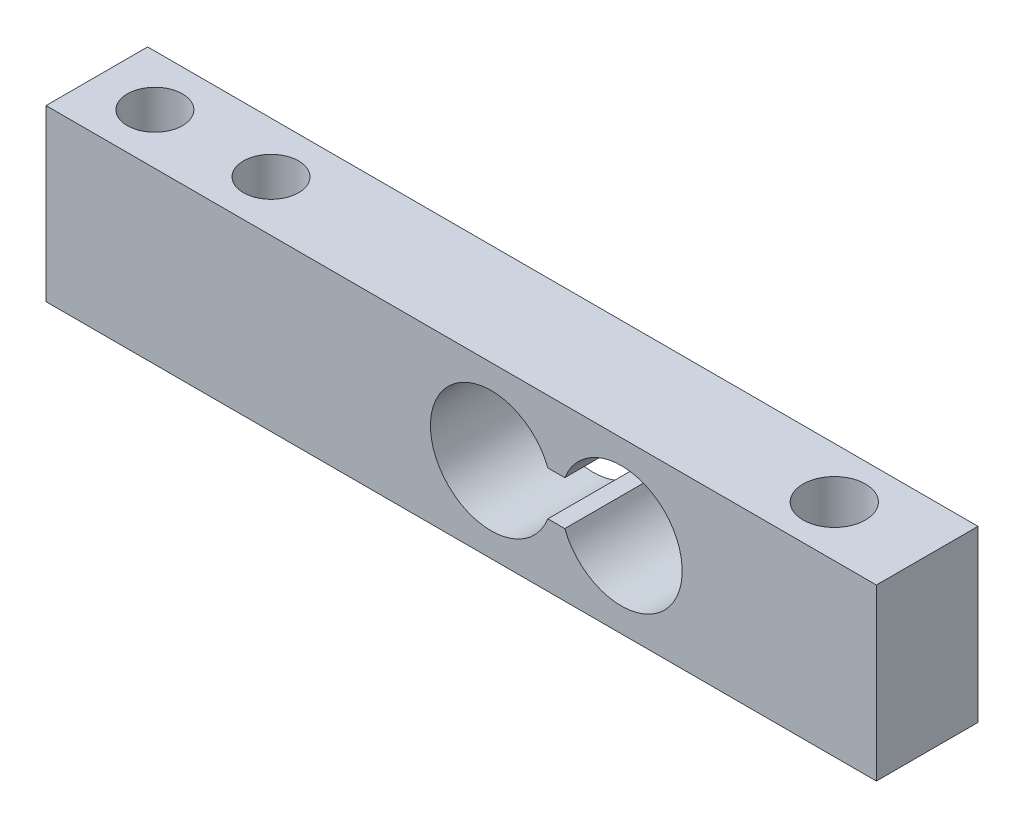
ISO-10303-21;
HEADER;
FILE_DESCRIPTION(('STEP AP214'),'2;1');
FILE_NAME('part.step','',(''),(''),'','','');
FILE_SCHEMA(('AUTOMOTIVE_DESIGN { 1 0 10303 214 1 1 1 1 }'));
ENDSEC;
DATA;
#1=APPLICATION_CONTEXT('core data for automotive mechanical design processes');
#2=APPLICATION_PROTOCOL_DEFINITION('international standard','automotive_design',2000,#1);
#3=PRODUCT_CONTEXT('',#1,'mechanical');
#4=PRODUCT('Part','Part','',(#3));
#5=PRODUCT_RELATED_PRODUCT_CATEGORY('part','',(#4));
#6=PRODUCT_DEFINITION_FORMATION('','',#4);
#7=PRODUCT_DEFINITION_CONTEXT('part definition',#1,'design');
#8=PRODUCT_DEFINITION('design','',#6,#7);
#9=PRODUCT_DEFINITION_SHAPE('','',#8);
#10=(LENGTH_UNIT() NAMED_UNIT(*) SI_UNIT(.MILLI.,.METRE.));
#11=(NAMED_UNIT(*) PLANE_ANGLE_UNIT() SI_UNIT($,.RADIAN.));
#12=(NAMED_UNIT(*) SI_UNIT($,.STERADIAN.) SOLID_ANGLE_UNIT());
#13=UNCERTAINTY_MEASURE_WITH_UNIT(LENGTH_MEASURE(1.E-05),#10,'distance_accuracy_value','');
#14=(GEOMETRIC_REPRESENTATION_CONTEXT(3) GLOBAL_UNCERTAINTY_ASSIGNED_CONTEXT((#13)) GLOBAL_UNIT_ASSIGNED_CONTEXT((#10,
#11,#12)) REPRESENTATION_CONTEXT('',''));
#15=CARTESIAN_POINT('',(0.,0.,0.));
#16=DIRECTION('',(0.,0.,1.));
#17=DIRECTION('',(1.,0.,0.));
#18=AXIS2_PLACEMENT_3D('',#15,#16,#17);
#19=CARTESIAN_POINT('',(0.,0.,7.));
#20=DIRECTION('',(1.,0.,0.));
#21=DIRECTION('',(0.,0.,-1.));
#22=AXIS2_PLACEMENT_3D('',#19,#20,#21);
#23=PLANE('',#22);
#24=DIRECTION('',(0.,-1.,0.));
#25=VECTOR('',#24,1.);
#26=CARTESIAN_POINT('',(0.,0.,0.));
#27=LINE('',#26,#25);
#28=CARTESIAN_POINT('',(0.,11.7,0.));
#29=VERTEX_POINT('',#28);
#30=CARTESIAN_POINT('',(0.,0.,0.));
#31=VERTEX_POINT('',#30);
#32=EDGE_CURVE('E155',#29,#31,#27,.T.);
#33=ORIENTED_EDGE('',*,*,#32,.T.);
#34=DIRECTION('',(0.,0.,-1.));
#35=VECTOR('',#34,1.);
#36=CARTESIAN_POINT('',(0.,0.,7.));
#37=LINE('',#36,#35);
#38=CARTESIAN_POINT('',(0.,0.,7.));
#39=VERTEX_POINT('',#38);
#40=EDGE_CURVE('E11',#39,#31,#37,.T.);
#41=ORIENTED_EDGE('',*,*,#40,.F.);
#42=DIRECTION('',(0.,-1.,0.));
#43=VECTOR('',#42,1.);
#44=CARTESIAN_POINT('',(0.,0.,7.));
#45=LINE('',#44,#43);
#46=CARTESIAN_POINT('',(0.,11.7,7.));
#47=VERTEX_POINT('',#46);
#48=EDGE_CURVE('E144',#47,#39,#45,.T.);
#49=ORIENTED_EDGE('',*,*,#48,.F.);
#50=DIRECTION('',(0.,0.,-1.));
#51=VECTOR('',#50,1.);
#52=CARTESIAN_POINT('',(0.,11.7,7.));
#53=LINE('',#52,#51);
#54=EDGE_CURVE('E154',#47,#29,#53,.T.);
#55=ORIENTED_EDGE('',*,*,#54,.T.);
#56=EDGE_LOOP('',(#33,#41,#49,#55));
#57=FACE_BOUND('',#56,.T.);
#58=ADVANCED_FACE('F32',(#57),#23,.F.);
#59=CARTESIAN_POINT('',(0.,0.,7.));
#60=DIRECTION('',(0.,1.,0.));
#61=DIRECTION('',(0.,0.,1.));
#62=AXIS2_PLACEMENT_3D('',#59,#60,#61);
#63=PLANE('',#62);
#64=CARTESIAN_POINT('',(50.8,0.,3.5));
#65=DIRECTION('',(0.,1.,0.));
#66=DIRECTION('',(0.,0.,1.));
#67=AXIS2_PLACEMENT_3D('',#64,#65,#66);
#68=CIRCLE('',#67,2.15);
#69=CARTESIAN_POINT('',(50.8,0.,5.65));
#70=VERTEX_POINT('',#69);
#71=EDGE_CURVE('E135',#70,#70,#68,.T.);
#72=ORIENTED_EDGE('',*,*,#71,.T.);
#73=EDGE_LOOP('',(#72));
#74=FACE_BOUND('',#73,.T.);
#75=CARTESIAN_POINT('',(4.,0.,3.5));
#76=DIRECTION('',(0.,1.,0.));
#77=DIRECTION('',(0.,0.,1.));
#78=AXIS2_PLACEMENT_3D('',#75,#76,#77);
#79=CIRCLE('',#78,1.9);
#80=CARTESIAN_POINT('',(4.,0.,5.4));
#81=VERTEX_POINT('',#80);
#82=EDGE_CURVE('E139',#81,#81,#79,.T.);
#83=ORIENTED_EDGE('',*,*,#82,.T.);
#84=EDGE_LOOP('',(#83));
#85=FACE_BOUND('',#84,.T.);
#86=CARTESIAN_POINT('',(12.,0.,3.5));
#87=DIRECTION('',(0.,1.,0.));
#88=DIRECTION('',(0.,0.,1.));
#89=AXIS2_PLACEMENT_3D('',#86,#87,#88);
#90=CIRCLE('',#89,1.9);
#91=CARTESIAN_POINT('',(12.,0.,5.4));
#92=VERTEX_POINT('',#91);
#93=EDGE_CURVE('E131',#92,#92,#90,.T.);
#94=ORIENTED_EDGE('',*,*,#93,.T.);
#95=EDGE_LOOP('',(#94));
#96=FACE_BOUND('',#95,.T.);
#97=DIRECTION('',(1.,0.,0.));
#98=VECTOR('',#97,1.);
#99=CARTESIAN_POINT('',(0.,0.,0.));
#100=LINE('',#99,#98);
#101=CARTESIAN_POINT('',(57.2,0.,0.));
#102=VERTEX_POINT('',#101);
#103=EDGE_CURVE('E158',#31,#102,#100,.T.);
#104=ORIENTED_EDGE('',*,*,#103,.T.);
#105=DIRECTION('',(0.,0.,-1.));
#106=VECTOR('',#105,1.);
#107=CARTESIAN_POINT('',(57.2,0.,7.));
#108=LINE('',#107,#106);
#109=CARTESIAN_POINT('',(57.2,0.,7.));
#110=VERTEX_POINT('',#109);
#111=EDGE_CURVE('E40',#110,#102,#108,.T.);
#112=ORIENTED_EDGE('',*,*,#111,.F.);
#113=DIRECTION('',(1.,0.,0.));
#114=VECTOR('',#113,1.);
#115=CARTESIAN_POINT('',(0.,0.,7.));
#116=LINE('',#115,#114);
#117=EDGE_CURVE('E147',#39,#110,#116,.T.);
#118=ORIENTED_EDGE('',*,*,#117,.F.);
#119=ORIENTED_EDGE('',*,*,#40,.T.);
#120=EDGE_LOOP('',(#104,#112,#118,#119));
#121=FACE_BOUND('',#120,.T.);
#122=ADVANCED_FACE('F196',(#74,#85,#96,#121),#63,.F.);
#123=CARTESIAN_POINT('',(57.2,0.,7.));
#124=DIRECTION('',(-1.,0.,0.));
#125=DIRECTION('',(0.,0.,1.));
#126=AXIS2_PLACEMENT_3D('',#123,#124,#125);
#127=PLANE('',#126);
#128=DIRECTION('',(0.,1.,0.));
#129=VECTOR('',#128,1.);
#130=CARTESIAN_POINT('',(57.2,0.,0.));
#131=LINE('',#130,#129);
#132=CARTESIAN_POINT('',(57.2,11.7,0.));
#133=VERTEX_POINT('',#132);
#134=EDGE_CURVE('E160',#102,#133,#131,.T.);
#135=ORIENTED_EDGE('',*,*,#134,.T.);
#136=DIRECTION('',(0.,0.,-1.));
#137=VECTOR('',#136,1.);
#138=CARTESIAN_POINT('',(57.2,11.7,7.));
#139=LINE('',#138,#137);
#140=CARTESIAN_POINT('',(57.2,11.7,7.));
#141=VERTEX_POINT('',#140);
#142=EDGE_CURVE('E165',#141,#133,#139,.T.);
#143=ORIENTED_EDGE('',*,*,#142,.F.);
#144=DIRECTION('',(0.,1.,0.));
#145=VECTOR('',#144,1.);
#146=CARTESIAN_POINT('',(57.2,0.,7.));
#147=LINE('',#146,#145);
#148=EDGE_CURVE('E150',#110,#141,#147,.T.);
#149=ORIENTED_EDGE('',*,*,#148,.F.);
#150=ORIENTED_EDGE('',*,*,#111,.T.);
#151=EDGE_LOOP('',(#135,#143,#149,#150));
#152=FACE_BOUND('',#151,.T.);
#153=ADVANCED_FACE('F201',(#152),#127,.F.);
#154=CARTESIAN_POINT('',(0.,11.7,7.));
#155=DIRECTION('',(0.,-1.,0.));
#156=DIRECTION('',(0.,0.,-1.));
#157=AXIS2_PLACEMENT_3D('',#154,#155,#156);
#158=PLANE('',#157);
#159=CARTESIAN_POINT('',(50.8,11.7,3.5));
#160=DIRECTION('',(0.,-1.,0.));
#161=DIRECTION('',(0.,0.,-1.));
#162=AXIS2_PLACEMENT_3D('',#159,#160,#161);
#163=CIRCLE('',#162,2.15);
#164=CARTESIAN_POINT('',(50.8,11.7,1.35));
#165=VERTEX_POINT('',#164);
#166=EDGE_CURVE('E35',#165,#165,#163,.T.);
#167=ORIENTED_EDGE('',*,*,#166,.T.);
#168=EDGE_LOOP('',(#167));
#169=FACE_BOUND('',#168,.T.);
#170=CARTESIAN_POINT('',(4.,11.7,3.5));
#171=DIRECTION('',(0.,-1.,0.));
#172=DIRECTION('',(0.,0.,-1.));
#173=AXIS2_PLACEMENT_3D('',#170,#171,#172);
#174=CIRCLE('',#173,1.9);
#175=CARTESIAN_POINT('',(4.,11.7,1.6));
#176=VERTEX_POINT('',#175);
#177=EDGE_CURVE('E171',#176,#176,#174,.T.);
#178=ORIENTED_EDGE('',*,*,#177,.T.);
#179=EDGE_LOOP('',(#178));
#180=FACE_BOUND('',#179,.T.);
#181=CARTESIAN_POINT('',(12.,11.7,3.5));
#182=DIRECTION('',(0.,-1.,0.));
#183=DIRECTION('',(0.,0.,-1.));
#184=AXIS2_PLACEMENT_3D('',#181,#182,#183);
#185=CIRCLE('',#184,1.9);
#186=CARTESIAN_POINT('',(12.,11.7,1.6));
#187=VERTEX_POINT('',#186);
#188=EDGE_CURVE('E138',#187,#187,#185,.T.);
#189=ORIENTED_EDGE('',*,*,#188,.T.);
#190=EDGE_LOOP('',(#189));
#191=FACE_BOUND('',#190,.T.);
#192=DIRECTION('',(-1.,0.,0.));
#193=VECTOR('',#192,1.);
#194=CARTESIAN_POINT('',(0.,11.7,0.));
#195=LINE('',#194,#193);
#196=EDGE_CURVE('E148',#133,#29,#195,.T.);
#197=ORIENTED_EDGE('',*,*,#196,.T.);
#198=ORIENTED_EDGE('',*,*,#54,.F.);
#199=DIRECTION('',(-1.,0.,0.));
#200=VECTOR('',#199,1.);
#201=CARTESIAN_POINT('',(0.,11.7,7.));
#202=LINE('',#201,#200);
#203=EDGE_CURVE('E152',#141,#47,#202,.T.);
#204=ORIENTED_EDGE('',*,*,#203,.F.);
#205=ORIENTED_EDGE('',*,*,#142,.T.);
#206=EDGE_LOOP('',(#197,#198,#204,#205));
#207=FACE_BOUND('',#206,.T.);
#208=ADVANCED_FACE('F178',(#169,#180,#191,#207),#158,.F.);
#209=CARTESIAN_POINT('',(0.,0.,7.));
#210=DIRECTION('',(0.,0.,-1.));
#211=DIRECTION('',(-1.,0.,0.));
#212=AXIS2_PLACEMENT_3D('',#209,#210,#211);
#213=PLANE('',#212);
#214=DIRECTION('',(1.,0.,0.));
#215=VECTOR('',#214,1.);
#216=CARTESIAN_POINT('',(35.7342066806368,4.33257045093554,7.));
#217=LINE('',#216,#215);
#218=CARTESIAN_POINT('',(34.570711979833,4.33257045093554,7.));
#219=VERTEX_POINT('',#218);
#220=CARTESIAN_POINT('',(35.7342066806368,4.33257045093554,7.));
#221=VERTEX_POINT('',#220);
#222=EDGE_CURVE('E125',#219,#221,#217,.T.);
#223=ORIENTED_EDGE('',*,*,#222,.F.);
#224=CARTESIAN_POINT('',(30.6683982628906,5.85,7.));
#225=DIRECTION('',(0.,0.,1.));
#226=DIRECTION('',(1.,0.,0.));
#227=AXIS2_PLACEMENT_3D('',#224,#225,#226);
#228=CIRCLE('',#227,4.18696128257841);
#229=CARTESIAN_POINT('',(34.570711979833,7.36742954906446,7.));
#230=VERTEX_POINT('',#229);
#231=EDGE_CURVE('E48',#230,#219,#228,.T.);
#232=ORIENTED_EDGE('',*,*,#231,.F.);
#233=DIRECTION('',(-1.,0.,0.));
#234=VECTOR('',#233,1.);
#235=CARTESIAN_POINT('',(34.570711979833,7.36742954906446,7.));
#236=LINE('',#235,#234);
#237=CARTESIAN_POINT('',(35.7342066806368,7.36742954906446,7.));
#238=VERTEX_POINT('',#237);
#239=EDGE_CURVE('E116',#238,#230,#236,.T.);
#240=ORIENTED_EDGE('',*,*,#239,.F.);
#241=CARTESIAN_POINT('',(39.6365203975792,5.85,7.));
#242=DIRECTION('',(0.,0.,1.));
#243=DIRECTION('',(1.,0.,0.));
#244=AXIS2_PLACEMENT_3D('',#241,#242,#243);
#245=CIRCLE('',#244,4.18696128257841);
#246=EDGE_CURVE('E119',#221,#238,#245,.T.);
#247=ORIENTED_EDGE('',*,*,#246,.F.);
#248=EDGE_LOOP('',(#223,#232,#240,#247));
#249=FACE_BOUND('',#248,.T.);
#250=ORIENTED_EDGE('',*,*,#48,.T.);
#251=ORIENTED_EDGE('',*,*,#117,.T.);
#252=ORIENTED_EDGE('',*,*,#148,.T.);
#253=ORIENTED_EDGE('',*,*,#203,.T.);
#254=EDGE_LOOP('',(#250,#251,#252,#253));
#255=FACE_BOUND('',#254,.T.);
#256=ADVANCED_FACE('F213',(#249,#255),#213,.F.);
#257=CARTESIAN_POINT('',(0.,0.,0.));
#258=DIRECTION('',(0.,0.,-1.));
#259=DIRECTION('',(-1.,0.,0.));
#260=AXIS2_PLACEMENT_3D('',#257,#258,#259);
#261=PLANE('',#260);
#262=CARTESIAN_POINT('',(30.6683982628906,5.85,0.));
#263=DIRECTION('',(0.,0.,1.));
#264=DIRECTION('',(1.,0.,0.));
#265=AXIS2_PLACEMENT_3D('',#262,#263,#264);
#266=CIRCLE('',#265,4.18696128257841);
#267=CARTESIAN_POINT('',(34.570711979833,7.36742954906446,0.));
#268=VERTEX_POINT('',#267);
#269=CARTESIAN_POINT('',(34.570711979833,4.33257045093554,0.));
#270=VERTEX_POINT('',#269);
#271=EDGE_CURVE('E100',#268,#270,#266,.T.);
#272=ORIENTED_EDGE('',*,*,#271,.T.);
#273=DIRECTION('',(1.,0.,0.));
#274=VECTOR('',#273,1.);
#275=CARTESIAN_POINT('',(35.7342066806368,4.33257045093554,0.));
#276=LINE('',#275,#274);
#277=CARTESIAN_POINT('',(35.7342066806368,4.33257045093554,0.));
#278=VERTEX_POINT('',#277);
#279=EDGE_CURVE('E109',#270,#278,#276,.T.);
#280=ORIENTED_EDGE('',*,*,#279,.T.);
#281=CARTESIAN_POINT('',(39.6365203975792,5.85,0.));
#282=DIRECTION('',(0.,0.,1.));
#283=DIRECTION('',(1.,0.,0.));
#284=AXIS2_PLACEMENT_3D('',#281,#282,#283);
#285=CIRCLE('',#284,4.18696128257841);
#286=CARTESIAN_POINT('',(35.7342066806368,7.36742954906446,0.));
#287=VERTEX_POINT('',#286);
#288=EDGE_CURVE('E56',#278,#287,#285,.T.);
#289=ORIENTED_EDGE('',*,*,#288,.T.);
#290=DIRECTION('',(-1.,0.,0.));
#291=VECTOR('',#290,1.);
#292=CARTESIAN_POINT('',(34.570711979833,7.36742954906446,0.));
#293=LINE('',#292,#291);
#294=EDGE_CURVE('E106',#287,#268,#293,.T.);
#295=ORIENTED_EDGE('',*,*,#294,.T.);
#296=EDGE_LOOP('',(#272,#280,#289,#295));
#297=FACE_BOUND('',#296,.T.);
#298=ORIENTED_EDGE('',*,*,#32,.F.);
#299=ORIENTED_EDGE('',*,*,#196,.F.);
#300=ORIENTED_EDGE('',*,*,#134,.F.);
#301=ORIENTED_EDGE('',*,*,#103,.F.);
#302=EDGE_LOOP('',(#298,#299,#300,#301));
#303=FACE_BOUND('',#302,.T.);
#304=ADVANCED_FACE('F113',(#297,#303),#261,.T.);
#305=CARTESIAN_POINT('',(12.,0.,3.5));
#306=DIRECTION('',(0.,1.,0.));
#307=DIRECTION('',(0.,0.,1.));
#308=AXIS2_PLACEMENT_3D('',#305,#306,#307);
#309=CYLINDRICAL_SURFACE('',#308,1.9);
#310=ORIENTED_EDGE('',*,*,#93,.F.);
#311=EDGE_LOOP('',(#310));
#312=FACE_BOUND('',#311,.T.);
#313=ORIENTED_EDGE('',*,*,#188,.F.);
#314=EDGE_LOOP('',(#313));
#315=FACE_BOUND('',#314,.T.);
#316=ADVANCED_FACE('F191',(#312,#315),#309,.F.);
#317=CARTESIAN_POINT('',(4.,0.,3.5));
#318=DIRECTION('',(0.,1.,0.));
#319=DIRECTION('',(0.,0.,1.));
#320=AXIS2_PLACEMENT_3D('',#317,#318,#319);
#321=CYLINDRICAL_SURFACE('',#320,1.9);
#322=ORIENTED_EDGE('',*,*,#82,.F.);
#323=EDGE_LOOP('',(#322));
#324=FACE_BOUND('',#323,.T.);
#325=ORIENTED_EDGE('',*,*,#177,.F.);
#326=EDGE_LOOP('',(#325));
#327=FACE_BOUND('',#326,.T.);
#328=ADVANCED_FACE('F182',(#324,#327),#321,.F.);
#329=CARTESIAN_POINT('',(50.8,0.,3.5));
#330=DIRECTION('',(0.,1.,0.));
#331=DIRECTION('',(0.,0.,1.));
#332=AXIS2_PLACEMENT_3D('',#329,#330,#331);
#333=CYLINDRICAL_SURFACE('',#332,2.15);
#334=ORIENTED_EDGE('',*,*,#71,.F.);
#335=EDGE_LOOP('',(#334));
#336=FACE_BOUND('',#335,.T.);
#337=ORIENTED_EDGE('',*,*,#166,.F.);
#338=EDGE_LOOP('',(#337));
#339=FACE_BOUND('',#338,.T.);
#340=ADVANCED_FACE('F180',(#336,#339),#333,.F.);
#341=CARTESIAN_POINT('',(30.6683982628906,5.85,0.));
#342=DIRECTION('',(0.,0.,1.));
#343=DIRECTION('',(1.,0.,0.));
#344=AXIS2_PLACEMENT_3D('',#341,#342,#343);
#345=CYLINDRICAL_SURFACE('',#344,4.18696128257841);
#346=ORIENTED_EDGE('',*,*,#231,.T.);
#347=DIRECTION('',(0.,0.,1.));
#348=VECTOR('',#347,1.);
#349=CARTESIAN_POINT('',(34.570711979833,4.33257045093554,0.));
#350=LINE('',#349,#348);
#351=EDGE_CURVE('E96',#270,#219,#350,.T.);
#352=ORIENTED_EDGE('',*,*,#351,.F.);
#353=ORIENTED_EDGE('',*,*,#271,.F.);
#354=DIRECTION('',(0.,0.,1.));
#355=VECTOR('',#354,1.);
#356=CARTESIAN_POINT('',(34.570711979833,7.36742954906446,0.));
#357=LINE('',#356,#355);
#358=EDGE_CURVE('E129',#268,#230,#357,.T.);
#359=ORIENTED_EDGE('',*,*,#358,.T.);
#360=EDGE_LOOP('',(#346,#352,#353,#359));
#361=FACE_BOUND('',#360,.T.);
#362=ADVANCED_FACE('F98',(#361),#345,.F.);
#363=CARTESIAN_POINT('',(34.570711979833,7.36742954906446,0.));
#364=DIRECTION('',(0.,1.,0.));
#365=DIRECTION('',(0.,0.,1.));
#366=AXIS2_PLACEMENT_3D('',#363,#364,#365);
#367=PLANE('',#366);
#368=ORIENTED_EDGE('',*,*,#239,.T.);
#369=ORIENTED_EDGE('',*,*,#358,.F.);
#370=ORIENTED_EDGE('',*,*,#294,.F.);
#371=DIRECTION('',(0.,0.,1.));
#372=VECTOR('',#371,1.);
#373=CARTESIAN_POINT('',(35.7342066806368,7.36742954906446,0.));
#374=LINE('',#373,#372);
#375=EDGE_CURVE('E132',#287,#238,#374,.T.);
#376=ORIENTED_EDGE('',*,*,#375,.T.);
#377=EDGE_LOOP('',(#368,#369,#370,#376));
#378=FACE_BOUND('',#377,.T.);
#379=ADVANCED_FACE('F189',(#378),#367,.F.);
#380=CARTESIAN_POINT('',(39.6365203975792,5.85,0.));
#381=DIRECTION('',(0.,0.,1.));
#382=DIRECTION('',(1.,0.,0.));
#383=AXIS2_PLACEMENT_3D('',#380,#381,#382);
#384=CYLINDRICAL_SURFACE('',#383,4.18696128257841);
#385=ORIENTED_EDGE('',*,*,#246,.T.);
#386=ORIENTED_EDGE('',*,*,#375,.F.);
#387=ORIENTED_EDGE('',*,*,#288,.F.);
#388=DIRECTION('',(0.,0.,1.));
#389=VECTOR('',#388,1.);
#390=CARTESIAN_POINT('',(35.7342066806368,4.33257045093554,0.));
#391=LINE('',#390,#389);
#392=EDGE_CURVE('E105',#278,#221,#391,.T.);
#393=ORIENTED_EDGE('',*,*,#392,.T.);
#394=EDGE_LOOP('',(#385,#386,#387,#393));
#395=FACE_BOUND('',#394,.T.);
#396=ADVANCED_FACE('F276',(#395),#384,.F.);
#397=CARTESIAN_POINT('',(35.7342066806368,4.33257045093554,0.));
#398=DIRECTION('',(0.,-1.,0.));
#399=DIRECTION('',(0.,0.,-1.));
#400=AXIS2_PLACEMENT_3D('',#397,#398,#399);
#401=PLANE('',#400);
#402=ORIENTED_EDGE('',*,*,#222,.T.);
#403=ORIENTED_EDGE('',*,*,#392,.F.);
#404=ORIENTED_EDGE('',*,*,#279,.F.);
#405=ORIENTED_EDGE('',*,*,#351,.T.);
#406=EDGE_LOOP('',(#402,#403,#404,#405));
#407=FACE_BOUND('',#406,.T.);
#408=ADVANCED_FACE('F110',(#407),#401,.F.);
#409=CLOSED_SHELL('',(#58,#122,#153,#208,#256,#304,#316,#328,#340,#362,#379,#396,#408));
#410=MANIFOLD_SOLID_BREP('B2',#409);
#411=ADVANCED_BREP_SHAPE_REPRESENTATION('',(#18,#410),#14);
#412=SHAPE_DEFINITION_REPRESENTATION(#9,#411);
ENDSEC;
END-ISO-10303-21;
